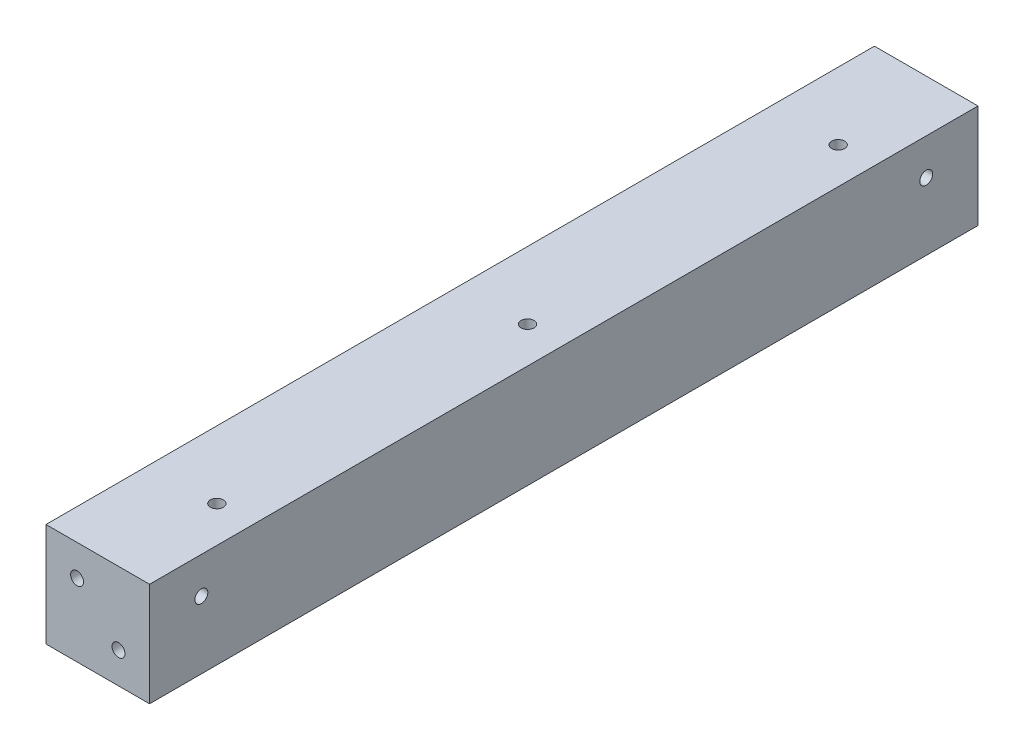
ISO-10303-21;
HEADER;
FILE_DESCRIPTION(('STEP AP214'),'2;1');
FILE_NAME('part.step','',(''),(''),'','','');
FILE_SCHEMA(('AUTOMOTIVE_DESIGN { 1 0 10303 214 1 1 1 1 }'));
ENDSEC;
DATA;
#1=APPLICATION_CONTEXT('core data for automotive mechanical design processes');
#2=APPLICATION_PROTOCOL_DEFINITION('international standard','automotive_design',2000,#1);
#3=PRODUCT_CONTEXT('',#1,'mechanical');
#4=PRODUCT('Part','Part','',(#3));
#5=PRODUCT_RELATED_PRODUCT_CATEGORY('part','',(#4));
#6=PRODUCT_DEFINITION_FORMATION('','',#4);
#7=PRODUCT_DEFINITION_CONTEXT('part definition',#1,'design');
#8=PRODUCT_DEFINITION('design','',#6,#7);
#9=PRODUCT_DEFINITION_SHAPE('','',#8);
#10=(LENGTH_UNIT() NAMED_UNIT(*) SI_UNIT(.MILLI.,.METRE.));
#11=(NAMED_UNIT(*) PLANE_ANGLE_UNIT() SI_UNIT($,.RADIAN.));
#12=(NAMED_UNIT(*) SI_UNIT($,.STERADIAN.) SOLID_ANGLE_UNIT());
#13=UNCERTAINTY_MEASURE_WITH_UNIT(LENGTH_MEASURE(1.E-05),#10,'distance_accuracy_value','');
#14=(GEOMETRIC_REPRESENTATION_CONTEXT(3) GLOBAL_UNCERTAINTY_ASSIGNED_CONTEXT((#13)) GLOBAL_UNIT_ASSIGNED_CONTEXT((#10,
#11,#12)) REPRESENTATION_CONTEXT('',''));
#15=CARTESIAN_POINT('',(0.,0.,0.));
#16=DIRECTION('',(0.,0.,1.));
#17=DIRECTION('',(1.,0.,0.));
#18=AXIS2_PLACEMENT_3D('',#15,#16,#17);
#19=CARTESIAN_POINT('',(0.,0.,160.));
#20=DIRECTION('',(1.,0.,0.));
#21=DIRECTION('',(0.,0.,-1.));
#22=AXIS2_PLACEMENT_3D('',#19,#20,#21);
#23=PLANE('',#22);
#24=CARTESIAN_POINT('',(0.,6.99999999999998,20.));
#25=DIRECTION('',(-1.,0.,0.));
#26=DIRECTION('',(0.,0.,1.));
#27=AXIS2_PLACEMENT_3D('',#24,#25,#26);
#28=CIRCLE('',#27,1.25);
#29=CARTESIAN_POINT('',(0.,6.99999999999998,21.25));
#30=VERTEX_POINT('',#29);
#31=EDGE_CURVE('E240',#30,#30,#28,.T.);
#32=ORIENTED_EDGE('',*,*,#31,.F.);
#33=EDGE_LOOP('',(#32));
#34=FACE_BOUND('',#33,.T.);
#35=CARTESIAN_POINT('',(0.,6.99999999999998,80.));
#36=DIRECTION('',(-1.,0.,0.));
#37=DIRECTION('',(0.,0.,1.));
#38=AXIS2_PLACEMENT_3D('',#35,#36,#37);
#39=CIRCLE('',#38,1.25);
#40=CARTESIAN_POINT('',(0.,6.99999999999998,81.25));
#41=VERTEX_POINT('',#40);
#42=EDGE_CURVE('E232',#41,#41,#39,.T.);
#43=ORIENTED_EDGE('',*,*,#42,.F.);
#44=EDGE_LOOP('',(#43));
#45=FACE_BOUND('',#44,.T.);
#46=CARTESIAN_POINT('',(0.,6.99999999999998,140.));
#47=DIRECTION('',(-1.,0.,0.));
#48=DIRECTION('',(0.,0.,1.));
#49=AXIS2_PLACEMENT_3D('',#46,#47,#48);
#50=CIRCLE('',#49,1.25000000000001);
#51=CARTESIAN_POINT('',(0.,6.99999999999998,141.25));
#52=VERTEX_POINT('',#51);
#53=EDGE_CURVE('E224',#52,#52,#50,.T.);
#54=ORIENTED_EDGE('',*,*,#53,.F.);
#55=EDGE_LOOP('',(#54));
#56=FACE_BOUND('',#55,.T.);
#57=DIRECTION('',(0.,-1.,0.));
#58=VECTOR('',#57,1.);
#59=CARTESIAN_POINT('',(0.,0.,0.));
#60=LINE('',#59,#58);
#61=CARTESIAN_POINT('',(0.,20.,0.));
#62=VERTEX_POINT('',#61);
#63=CARTESIAN_POINT('',(0.,0.,0.));
#64=VERTEX_POINT('',#63);
#65=EDGE_CURVE('E113',#62,#64,#60,.T.);
#66=ORIENTED_EDGE('',*,*,#65,.T.);
#67=DIRECTION('',(0.,0.,-1.));
#68=VECTOR('',#67,1.);
#69=CARTESIAN_POINT('',(0.,0.,160.));
#70=LINE('',#69,#68);
#71=CARTESIAN_POINT('',(0.,0.,160.));
#72=VERTEX_POINT('',#71);
#73=EDGE_CURVE('E11',#72,#64,#70,.T.);
#74=ORIENTED_EDGE('',*,*,#73,.F.);
#75=DIRECTION('',(0.,-1.,0.));
#76=VECTOR('',#75,1.);
#77=CARTESIAN_POINT('',(0.,0.,160.));
#78=LINE('',#77,#76);
#79=CARTESIAN_POINT('',(0.,20.,160.));
#80=VERTEX_POINT('',#79);
#81=EDGE_CURVE('E96',#80,#72,#78,.T.);
#82=ORIENTED_EDGE('',*,*,#81,.F.);
#83=DIRECTION('',(0.,0.,-1.));
#84=VECTOR('',#83,1.);
#85=CARTESIAN_POINT('',(0.,20.,160.));
#86=LINE('',#85,#84);
#87=EDGE_CURVE('E109',#80,#62,#86,.T.);
#88=ORIENTED_EDGE('',*,*,#87,.T.);
#89=EDGE_LOOP('',(#66,#74,#82,#88));
#90=FACE_BOUND('',#89,.T.);
#91=ADVANCED_FACE('F44',(#34,#45,#56,#90),#23,.F.);
#92=CARTESIAN_POINT('',(0.,0.,160.));
#93=DIRECTION('',(0.,1.,0.));
#94=DIRECTION('',(0.,0.,1.));
#95=AXIS2_PLACEMENT_3D('',#92,#93,#94);
#96=PLANE('',#95);
#97=CARTESIAN_POINT('',(7.,0.,10.));
#98=DIRECTION('',(0.,-1.,0.));
#99=DIRECTION('',(0.,0.,-1.));
#100=AXIS2_PLACEMENT_3D('',#97,#98,#99);
#101=CIRCLE('',#100,1.25);
#102=CARTESIAN_POINT('',(7.,0.,8.75));
#103=VERTEX_POINT('',#102);
#104=EDGE_CURVE('E193',#103,#103,#101,.T.);
#105=ORIENTED_EDGE('',*,*,#104,.F.);
#106=EDGE_LOOP('',(#105));
#107=FACE_BOUND('',#106,.T.);
#108=CARTESIAN_POINT('',(7.,0.,150.));
#109=DIRECTION('',(0.,-1.,0.));
#110=DIRECTION('',(0.,0.,-1.));
#111=AXIS2_PLACEMENT_3D('',#108,#109,#110);
#112=CIRCLE('',#111,1.25);
#113=CARTESIAN_POINT('',(7.,0.,148.75));
#114=VERTEX_POINT('',#113);
#115=EDGE_CURVE('E184',#114,#114,#112,.T.);
#116=ORIENTED_EDGE('',*,*,#115,.F.);
#117=EDGE_LOOP('',(#116));
#118=FACE_BOUND('',#117,.T.);
#119=DIRECTION('',(1.,0.,0.));
#120=VECTOR('',#119,1.);
#121=CARTESIAN_POINT('',(0.,0.,0.));
#122=LINE('',#121,#120);
#123=CARTESIAN_POINT('',(20.,0.,0.));
#124=VERTEX_POINT('',#123);
#125=EDGE_CURVE('E101',#64,#124,#122,.T.);
#126=ORIENTED_EDGE('',*,*,#125,.T.);
#127=DIRECTION('',(0.,0.,-1.));
#128=VECTOR('',#127,1.);
#129=CARTESIAN_POINT('',(20.,0.,160.));
#130=LINE('',#129,#128);
#131=CARTESIAN_POINT('',(20.,0.,160.));
#132=VERTEX_POINT('',#131);
#133=EDGE_CURVE('E53',#132,#124,#130,.T.);
#134=ORIENTED_EDGE('',*,*,#133,.F.);
#135=DIRECTION('',(1.,0.,0.));
#136=VECTOR('',#135,1.);
#137=CARTESIAN_POINT('',(0.,0.,160.));
#138=LINE('',#137,#136);
#139=EDGE_CURVE('E91',#72,#132,#138,.T.);
#140=ORIENTED_EDGE('',*,*,#139,.F.);
#141=ORIENTED_EDGE('',*,*,#73,.T.);
#142=EDGE_LOOP('',(#126,#134,#140,#141));
#143=FACE_BOUND('',#142,.T.);
#144=ADVANCED_FACE('F100',(#107,#118,#143),#96,.F.);
#145=CARTESIAN_POINT('',(20.,0.,160.));
#146=DIRECTION('',(-1.,0.,0.));
#147=DIRECTION('',(0.,0.,1.));
#148=AXIS2_PLACEMENT_3D('',#145,#146,#147);
#149=PLANE('',#148);
#150=CARTESIAN_POINT('',(20.,13.,10.));
#151=DIRECTION('',(1.,0.,0.));
#152=DIRECTION('',(0.,0.,-1.));
#153=AXIS2_PLACEMENT_3D('',#150,#151,#152);
#154=CIRCLE('',#153,1.25);
#155=CARTESIAN_POINT('',(20.,13.,8.75));
#156=VERTEX_POINT('',#155);
#157=EDGE_CURVE('E177',#156,#156,#154,.T.);
#158=ORIENTED_EDGE('',*,*,#157,.F.);
#159=EDGE_LOOP('',(#158));
#160=FACE_BOUND('',#159,.T.);
#161=CARTESIAN_POINT('',(20.,13.,150.));
#162=DIRECTION('',(1.,0.,0.));
#163=DIRECTION('',(0.,0.,-1.));
#164=AXIS2_PLACEMENT_3D('',#161,#162,#163);
#165=CIRCLE('',#164,1.25000000000001);
#166=CARTESIAN_POINT('',(20.,13.,148.75));
#167=VERTEX_POINT('',#166);
#168=EDGE_CURVE('E168',#167,#167,#165,.T.);
#169=ORIENTED_EDGE('',*,*,#168,.F.);
#170=EDGE_LOOP('',(#169));
#171=FACE_BOUND('',#170,.T.);
#172=DIRECTION('',(0.,1.,0.));
#173=VECTOR('',#172,1.);
#174=CARTESIAN_POINT('',(20.,0.,0.));
#175=LINE('',#174,#173);
#176=CARTESIAN_POINT('',(20.,20.,0.));
#177=VERTEX_POINT('',#176);
#178=EDGE_CURVE('E78',#124,#177,#175,.T.);
#179=ORIENTED_EDGE('',*,*,#178,.T.);
#180=DIRECTION('',(0.,0.,-1.));
#181=VECTOR('',#180,1.);
#182=CARTESIAN_POINT('',(20.,20.,160.));
#183=LINE('',#182,#181);
#184=CARTESIAN_POINT('',(20.,20.,160.));
#185=VERTEX_POINT('',#184);
#186=EDGE_CURVE('E103',#185,#177,#183,.T.);
#187=ORIENTED_EDGE('',*,*,#186,.F.);
#188=DIRECTION('',(0.,1.,0.));
#189=VECTOR('',#188,1.);
#190=CARTESIAN_POINT('',(20.,0.,160.));
#191=LINE('',#190,#189);
#192=EDGE_CURVE('E94',#132,#185,#191,.T.);
#193=ORIENTED_EDGE('',*,*,#192,.F.);
#194=ORIENTED_EDGE('',*,*,#133,.T.);
#195=EDGE_LOOP('',(#179,#187,#193,#194));
#196=FACE_BOUND('',#195,.T.);
#197=ADVANCED_FACE('F104',(#160,#171,#196),#149,.F.);
#198=CARTESIAN_POINT('',(0.,20.,160.));
#199=DIRECTION('',(0.,-1.,0.));
#200=DIRECTION('',(0.,0.,-1.));
#201=AXIS2_PLACEMENT_3D('',#198,#199,#200);
#202=PLANE('',#201);
#203=CARTESIAN_POINT('',(13.,20.,20.));
#204=DIRECTION('',(0.,1.,0.));
#205=DIRECTION('',(0.,0.,1.));
#206=AXIS2_PLACEMENT_3D('',#203,#204,#205);
#207=CIRCLE('',#206,1.25);
#208=CARTESIAN_POINT('',(13.,20.,21.25));
#209=VERTEX_POINT('',#208);
#210=EDGE_CURVE('E217',#209,#209,#207,.T.);
#211=ORIENTED_EDGE('',*,*,#210,.F.);
#212=EDGE_LOOP('',(#211));
#213=FACE_BOUND('',#212,.T.);
#214=CARTESIAN_POINT('',(13.,20.,80.));
#215=DIRECTION('',(0.,1.,0.));
#216=DIRECTION('',(0.,0.,1.));
#217=AXIS2_PLACEMENT_3D('',#214,#215,#216);
#218=CIRCLE('',#217,1.25);
#219=CARTESIAN_POINT('',(13.,20.,81.25));
#220=VERTEX_POINT('',#219);
#221=EDGE_CURVE('E209',#220,#220,#218,.T.);
#222=ORIENTED_EDGE('',*,*,#221,.F.);
#223=EDGE_LOOP('',(#222));
#224=FACE_BOUND('',#223,.T.);
#225=CARTESIAN_POINT('',(13.,20.,140.));
#226=DIRECTION('',(0.,1.,0.));
#227=DIRECTION('',(0.,0.,1.));
#228=AXIS2_PLACEMENT_3D('',#225,#226,#227);
#229=CIRCLE('',#228,1.25);
#230=CARTESIAN_POINT('',(13.,20.,141.25));
#231=VERTEX_POINT('',#230);
#232=EDGE_CURVE('E200',#231,#231,#229,.T.);
#233=ORIENTED_EDGE('',*,*,#232,.F.);
#234=EDGE_LOOP('',(#233));
#235=FACE_BOUND('',#234,.T.);
#236=DIRECTION('',(-1.,0.,0.));
#237=VECTOR('',#236,1.);
#238=CARTESIAN_POINT('',(0.,20.,0.));
#239=LINE('',#238,#237);
#240=EDGE_CURVE('E84',#177,#62,#239,.T.);
#241=ORIENTED_EDGE('',*,*,#240,.T.);
#242=ORIENTED_EDGE('',*,*,#87,.F.);
#243=DIRECTION('',(-1.,0.,0.));
#244=VECTOR('',#243,1.);
#245=CARTESIAN_POINT('',(0.,20.,160.));
#246=LINE('',#245,#244);
#247=EDGE_CURVE('E61',#185,#80,#246,.T.);
#248=ORIENTED_EDGE('',*,*,#247,.F.);
#249=ORIENTED_EDGE('',*,*,#186,.T.);
#250=EDGE_LOOP('',(#241,#242,#248,#249));
#251=FACE_BOUND('',#250,.T.);
#252=ADVANCED_FACE('F128',(#213,#224,#235,#251),#202,.F.);
#253=CARTESIAN_POINT('',(0.,0.,160.));
#254=DIRECTION('',(0.,0.,-1.));
#255=DIRECTION('',(-1.,0.,0.));
#256=AXIS2_PLACEMENT_3D('',#253,#254,#255);
#257=PLANE('',#256);
#258=CARTESIAN_POINT('',(6.,14.,160.));
#259=DIRECTION('',(0.,0.,1.));
#260=DIRECTION('',(1.,0.,0.));
#261=AXIS2_PLACEMENT_3D('',#258,#259,#260);
#262=CIRCLE('',#261,1.25);
#263=CARTESIAN_POINT('',(7.25,14.,160.));
#264=VERTEX_POINT('',#263);
#265=EDGE_CURVE('E145',#264,#264,#262,.T.);
#266=ORIENTED_EDGE('',*,*,#265,.F.);
#267=EDGE_LOOP('',(#266));
#268=FACE_BOUND('',#267,.T.);
#269=CARTESIAN_POINT('',(14.,6.,160.));
#270=DIRECTION('',(0.,0.,1.));
#271=DIRECTION('',(1.,0.,0.));
#272=AXIS2_PLACEMENT_3D('',#269,#270,#271);
#273=CIRCLE('',#272,1.25);
#274=CARTESIAN_POINT('',(15.25,6.,160.));
#275=VERTEX_POINT('',#274);
#276=EDGE_CURVE('E136',#275,#275,#273,.T.);
#277=ORIENTED_EDGE('',*,*,#276,.F.);
#278=EDGE_LOOP('',(#277));
#279=FACE_BOUND('',#278,.T.);
#280=ORIENTED_EDGE('',*,*,#81,.T.);
#281=ORIENTED_EDGE('',*,*,#139,.T.);
#282=ORIENTED_EDGE('',*,*,#192,.T.);
#283=ORIENTED_EDGE('',*,*,#247,.T.);
#284=EDGE_LOOP('',(#280,#281,#282,#283));
#285=FACE_BOUND('',#284,.T.);
#286=ADVANCED_FACE('F92',(#268,#279,#285),#257,.F.);
#287=CARTESIAN_POINT('',(0.,0.,0.));
#288=DIRECTION('',(0.,0.,-1.));
#289=DIRECTION('',(-1.,0.,0.));
#290=AXIS2_PLACEMENT_3D('',#287,#288,#289);
#291=PLANE('',#290);
#292=CARTESIAN_POINT('',(14.,6.,0.));
#293=DIRECTION('',(0.,0.,-1.));
#294=DIRECTION('',(-1.,0.,0.));
#295=AXIS2_PLACEMENT_3D('',#292,#293,#294);
#296=CIRCLE('',#295,1.25);
#297=CARTESIAN_POINT('',(12.75,6.,0.));
#298=VERTEX_POINT('',#297);
#299=EDGE_CURVE('E161',#298,#298,#296,.T.);
#300=ORIENTED_EDGE('',*,*,#299,.F.);
#301=EDGE_LOOP('',(#300));
#302=FACE_BOUND('',#301,.T.);
#303=CARTESIAN_POINT('',(6.,14.,0.));
#304=DIRECTION('',(0.,0.,-1.));
#305=DIRECTION('',(-1.,0.,0.));
#306=AXIS2_PLACEMENT_3D('',#303,#304,#305);
#307=CIRCLE('',#306,1.25);
#308=CARTESIAN_POINT('',(4.75,14.,0.));
#309=VERTEX_POINT('',#308);
#310=EDGE_CURVE('E152',#309,#309,#307,.T.);
#311=ORIENTED_EDGE('',*,*,#310,.F.);
#312=EDGE_LOOP('',(#311));
#313=FACE_BOUND('',#312,.T.);
#314=ORIENTED_EDGE('',*,*,#65,.F.);
#315=ORIENTED_EDGE('',*,*,#240,.F.);
#316=ORIENTED_EDGE('',*,*,#178,.F.);
#317=ORIENTED_EDGE('',*,*,#125,.F.);
#318=EDGE_LOOP('',(#314,#315,#316,#317));
#319=FACE_BOUND('',#318,.T.);
#320=ADVANCED_FACE('F131',(#302,#313,#319),#291,.T.);
#321=CARTESIAN_POINT('',(14.,6.,150.));
#322=DIRECTION('',(0.,0.,1.));
#323=DIRECTION('',(1.,0.,0.));
#324=AXIS2_PLACEMENT_3D('',#321,#322,#323);
#325=CYLINDRICAL_SURFACE('',#324,1.25);
#326=CARTESIAN_POINT('',(14.,6.,150.));
#327=DIRECTION('',(0.,0.,1.));
#328=DIRECTION('',(1.,0.,0.));
#329=AXIS2_PLACEMENT_3D('',#326,#327,#328);
#330=CIRCLE('',#329,1.25);
#331=CARTESIAN_POINT('',(15.25,6.,150.));
#332=VERTEX_POINT('',#331);
#333=EDGE_CURVE('E140',#332,#332,#330,.T.);
#334=ORIENTED_EDGE('',*,*,#333,.F.);
#335=EDGE_LOOP('',(#334));
#336=FACE_BOUND('',#335,.T.);
#337=ORIENTED_EDGE('',*,*,#276,.T.);
#338=EDGE_LOOP('',(#337));
#339=FACE_BOUND('',#338,.T.);
#340=ADVANCED_FACE('F361',(#336,#339),#325,.F.);
#341=CARTESIAN_POINT('',(14.,6.,150.));
#342=DIRECTION('',(0.,0.,1.));
#343=DIRECTION('',(1.,0.,0.));
#344=AXIS2_PLACEMENT_3D('',#341,#342,#343);
#345=PLANE('',#344);
#346=ORIENTED_EDGE('',*,*,#333,.T.);
#347=EDGE_LOOP('',(#346));
#348=FACE_BOUND('',#347,.T.);
#349=ADVANCED_FACE('F357',(#348),#345,.T.);
#350=CARTESIAN_POINT('',(6.,14.,150.));
#351=DIRECTION('',(0.,0.,1.));
#352=DIRECTION('',(1.,0.,0.));
#353=AXIS2_PLACEMENT_3D('',#350,#351,#352);
#354=CYLINDRICAL_SURFACE('',#353,1.25);
#355=CARTESIAN_POINT('',(6.,14.,150.));
#356=DIRECTION('',(0.,0.,1.));
#357=DIRECTION('',(1.,0.,0.));
#358=AXIS2_PLACEMENT_3D('',#355,#356,#357);
#359=CIRCLE('',#358,1.25);
#360=CARTESIAN_POINT('',(7.25,14.,150.));
#361=VERTEX_POINT('',#360);
#362=EDGE_CURVE('E117',#361,#361,#359,.T.);
#363=ORIENTED_EDGE('',*,*,#362,.F.);
#364=EDGE_LOOP('',(#363));
#365=FACE_BOUND('',#364,.T.);
#366=ORIENTED_EDGE('',*,*,#265,.T.);
#367=EDGE_LOOP('',(#366));
#368=FACE_BOUND('',#367,.T.);
#369=ADVANCED_FACE('F353',(#365,#368),#354,.F.);
#370=CARTESIAN_POINT('',(6.,14.,150.));
#371=DIRECTION('',(0.,0.,1.));
#372=DIRECTION('',(1.,0.,0.));
#373=AXIS2_PLACEMENT_3D('',#370,#371,#372);
#374=PLANE('',#373);
#375=ORIENTED_EDGE('',*,*,#362,.T.);
#376=EDGE_LOOP('',(#375));
#377=FACE_BOUND('',#376,.T.);
#378=ADVANCED_FACE('F349',(#377),#374,.T.);
#379=CARTESIAN_POINT('',(6.,14.,10.));
#380=DIRECTION('',(0.,0.,-1.));
#381=DIRECTION('',(-1.,0.,0.));
#382=AXIS2_PLACEMENT_3D('',#379,#380,#381);
#383=CYLINDRICAL_SURFACE('',#382,1.25);
#384=CARTESIAN_POINT('',(6.,14.,10.));
#385=DIRECTION('',(0.,0.,-1.));
#386=DIRECTION('',(-1.,0.,0.));
#387=AXIS2_PLACEMENT_3D('',#384,#385,#386);
#388=CIRCLE('',#387,1.25);
#389=CARTESIAN_POINT('',(4.75,14.,10.));
#390=VERTEX_POINT('',#389);
#391=EDGE_CURVE('E156',#390,#390,#388,.T.);
#392=ORIENTED_EDGE('',*,*,#391,.F.);
#393=EDGE_LOOP('',(#392));
#394=FACE_BOUND('',#393,.T.);
#395=ORIENTED_EDGE('',*,*,#310,.T.);
#396=EDGE_LOOP('',(#395));
#397=FACE_BOUND('',#396,.T.);
#398=ADVANCED_FACE('F345',(#394,#397),#383,.F.);
#399=CARTESIAN_POINT('',(6.,14.,10.));
#400=DIRECTION('',(0.,0.,-1.));
#401=DIRECTION('',(-1.,0.,0.));
#402=AXIS2_PLACEMENT_3D('',#399,#400,#401);
#403=PLANE('',#402);
#404=ORIENTED_EDGE('',*,*,#391,.T.);
#405=EDGE_LOOP('',(#404));
#406=FACE_BOUND('',#405,.T.);
#407=ADVANCED_FACE('F341',(#406),#403,.T.);
#408=CARTESIAN_POINT('',(14.,6.,10.));
#409=DIRECTION('',(0.,0.,-1.));
#410=DIRECTION('',(-1.,0.,0.));
#411=AXIS2_PLACEMENT_3D('',#408,#409,#410);
#412=CYLINDRICAL_SURFACE('',#411,1.25);
#413=CARTESIAN_POINT('',(14.,6.,10.));
#414=DIRECTION('',(0.,0.,-1.));
#415=DIRECTION('',(-1.,0.,0.));
#416=AXIS2_PLACEMENT_3D('',#413,#414,#415);
#417=CIRCLE('',#416,1.25);
#418=CARTESIAN_POINT('',(12.75,6.,10.));
#419=VERTEX_POINT('',#418);
#420=EDGE_CURVE('E141',#419,#419,#417,.T.);
#421=ORIENTED_EDGE('',*,*,#420,.F.);
#422=EDGE_LOOP('',(#421));
#423=FACE_BOUND('',#422,.T.);
#424=ORIENTED_EDGE('',*,*,#299,.T.);
#425=EDGE_LOOP('',(#424));
#426=FACE_BOUND('',#425,.T.);
#427=ADVANCED_FACE('F337',(#423,#426),#412,.F.);
#428=CARTESIAN_POINT('',(14.,6.,10.));
#429=DIRECTION('',(0.,0.,-1.));
#430=DIRECTION('',(-1.,0.,0.));
#431=AXIS2_PLACEMENT_3D('',#428,#429,#430);
#432=PLANE('',#431);
#433=ORIENTED_EDGE('',*,*,#420,.T.);
#434=EDGE_LOOP('',(#433));
#435=FACE_BOUND('',#434,.T.);
#436=ADVANCED_FACE('F333',(#435),#432,.T.);
#437=CARTESIAN_POINT('',(10.,13.,150.));
#438=DIRECTION('',(1.,0.,0.));
#439=DIRECTION('',(0.,0.,-1.));
#440=AXIS2_PLACEMENT_3D('',#437,#438,#439);
#441=CYLINDRICAL_SURFACE('',#440,1.25000000000001);
#442=CARTESIAN_POINT('',(10.,13.,150.));
#443=DIRECTION('',(1.,0.,0.));
#444=DIRECTION('',(0.,0.,-1.));
#445=AXIS2_PLACEMENT_3D('',#442,#443,#444);
#446=CIRCLE('',#445,1.25000000000001);
#447=CARTESIAN_POINT('',(10.,13.,148.75));
#448=VERTEX_POINT('',#447);
#449=EDGE_CURVE('E172',#448,#448,#446,.T.);
#450=ORIENTED_EDGE('',*,*,#449,.F.);
#451=EDGE_LOOP('',(#450));
#452=FACE_BOUND('',#451,.T.);
#453=ORIENTED_EDGE('',*,*,#168,.T.);
#454=EDGE_LOOP('',(#453));
#455=FACE_BOUND('',#454,.T.);
#456=ADVANCED_FACE('F329',(#452,#455),#441,.F.);
#457=CARTESIAN_POINT('',(10.,13.,150.));
#458=DIRECTION('',(1.,0.,0.));
#459=DIRECTION('',(0.,0.,-1.));
#460=AXIS2_PLACEMENT_3D('',#457,#458,#459);
#461=PLANE('',#460);
#462=ORIENTED_EDGE('',*,*,#449,.T.);
#463=EDGE_LOOP('',(#462));
#464=FACE_BOUND('',#463,.T.);
#465=ADVANCED_FACE('F325',(#464),#461,.T.);
#466=CARTESIAN_POINT('',(10.,13.,10.));
#467=DIRECTION('',(1.,0.,0.));
#468=DIRECTION('',(0.,0.,-1.));
#469=AXIS2_PLACEMENT_3D('',#466,#467,#468);
#470=CYLINDRICAL_SURFACE('',#469,1.25);
#471=CARTESIAN_POINT('',(10.,13.,10.));
#472=DIRECTION('',(1.,0.,0.));
#473=DIRECTION('',(0.,0.,-1.));
#474=AXIS2_PLACEMENT_3D('',#471,#472,#473);
#475=CIRCLE('',#474,1.25);
#476=CARTESIAN_POINT('',(10.,13.,8.75));
#477=VERTEX_POINT('',#476);
#478=EDGE_CURVE('E157',#477,#477,#475,.T.);
#479=ORIENTED_EDGE('',*,*,#478,.F.);
#480=EDGE_LOOP('',(#479));
#481=FACE_BOUND('',#480,.T.);
#482=ORIENTED_EDGE('',*,*,#157,.T.);
#483=EDGE_LOOP('',(#482));
#484=FACE_BOUND('',#483,.T.);
#485=ADVANCED_FACE('F321',(#481,#484),#470,.F.);
#486=CARTESIAN_POINT('',(10.,13.,10.));
#487=DIRECTION('',(1.,0.,0.));
#488=DIRECTION('',(0.,0.,-1.));
#489=AXIS2_PLACEMENT_3D('',#486,#487,#488);
#490=PLANE('',#489);
#491=ORIENTED_EDGE('',*,*,#478,.T.);
#492=EDGE_LOOP('',(#491));
#493=FACE_BOUND('',#492,.T.);
#494=ADVANCED_FACE('F317',(#493),#490,.T.);
#495=CARTESIAN_POINT('',(7.,10.,150.));
#496=DIRECTION('',(0.,-1.,0.));
#497=DIRECTION('',(0.,0.,-1.));
#498=AXIS2_PLACEMENT_3D('',#495,#496,#497);
#499=CYLINDRICAL_SURFACE('',#498,1.25);
#500=CARTESIAN_POINT('',(7.,10.,150.));
#501=DIRECTION('',(0.,-1.,0.));
#502=DIRECTION('',(0.,0.,-1.));
#503=AXIS2_PLACEMENT_3D('',#500,#501,#502);
#504=CIRCLE('',#503,1.25);
#505=CARTESIAN_POINT('',(7.,10.,148.75));
#506=VERTEX_POINT('',#505);
#507=EDGE_CURVE('E188',#506,#506,#504,.T.);
#508=ORIENTED_EDGE('',*,*,#507,.F.);
#509=EDGE_LOOP('',(#508));
#510=FACE_BOUND('',#509,.T.);
#511=ORIENTED_EDGE('',*,*,#115,.T.);
#512=EDGE_LOOP('',(#511));
#513=FACE_BOUND('',#512,.T.);
#514=ADVANCED_FACE('F313',(#510,#513),#499,.F.);
#515=CARTESIAN_POINT('',(7.,10.,150.));
#516=DIRECTION('',(0.,-1.,0.));
#517=DIRECTION('',(0.,0.,-1.));
#518=AXIS2_PLACEMENT_3D('',#515,#516,#517);
#519=PLANE('',#518);
#520=ORIENTED_EDGE('',*,*,#507,.T.);
#521=EDGE_LOOP('',(#520));
#522=FACE_BOUND('',#521,.T.);
#523=ADVANCED_FACE('F309',(#522),#519,.T.);
#524=CARTESIAN_POINT('',(7.,10.,10.));
#525=DIRECTION('',(0.,-1.,0.));
#526=DIRECTION('',(0.,0.,-1.));
#527=AXIS2_PLACEMENT_3D('',#524,#525,#526);
#528=CYLINDRICAL_SURFACE('',#527,1.25);
#529=CARTESIAN_POINT('',(7.,10.,10.));
#530=DIRECTION('',(0.,-1.,0.));
#531=DIRECTION('',(0.,0.,-1.));
#532=AXIS2_PLACEMENT_3D('',#529,#530,#531);
#533=CIRCLE('',#532,1.25);
#534=CARTESIAN_POINT('',(7.,10.,8.75));
#535=VERTEX_POINT('',#534);
#536=EDGE_CURVE('E173',#535,#535,#533,.T.);
#537=ORIENTED_EDGE('',*,*,#536,.F.);
#538=EDGE_LOOP('',(#537));
#539=FACE_BOUND('',#538,.T.);
#540=ORIENTED_EDGE('',*,*,#104,.T.);
#541=EDGE_LOOP('',(#540));
#542=FACE_BOUND('',#541,.T.);
#543=ADVANCED_FACE('F305',(#539,#542),#528,.F.);
#544=CARTESIAN_POINT('',(7.,10.,10.));
#545=DIRECTION('',(0.,-1.,0.));
#546=DIRECTION('',(0.,0.,-1.));
#547=AXIS2_PLACEMENT_3D('',#544,#545,#546);
#548=PLANE('',#547);
#549=ORIENTED_EDGE('',*,*,#536,.T.);
#550=EDGE_LOOP('',(#549));
#551=FACE_BOUND('',#550,.T.);
#552=ADVANCED_FACE('F301',(#551),#548,.T.);
#553=CARTESIAN_POINT('',(13.,10.,140.));
#554=DIRECTION('',(0.,1.,0.));
#555=DIRECTION('',(0.,0.,1.));
#556=AXIS2_PLACEMENT_3D('',#553,#554,#555);
#557=CYLINDRICAL_SURFACE('',#556,1.25);
#558=CARTESIAN_POINT('',(13.,10.,140.));
#559=DIRECTION('',(0.,1.,0.));
#560=DIRECTION('',(0.,0.,1.));
#561=AXIS2_PLACEMENT_3D('',#558,#559,#560);
#562=CIRCLE('',#561,1.25);
#563=CARTESIAN_POINT('',(13.,10.,141.25));
#564=VERTEX_POINT('',#563);
#565=EDGE_CURVE('E204',#564,#564,#562,.T.);
#566=ORIENTED_EDGE('',*,*,#565,.F.);
#567=EDGE_LOOP('',(#566));
#568=FACE_BOUND('',#567,.T.);
#569=ORIENTED_EDGE('',*,*,#232,.T.);
#570=EDGE_LOOP('',(#569));
#571=FACE_BOUND('',#570,.T.);
#572=ADVANCED_FACE('F297',(#568,#571),#557,.F.);
#573=CARTESIAN_POINT('',(13.,10.,140.));
#574=DIRECTION('',(0.,1.,0.));
#575=DIRECTION('',(0.,0.,1.));
#576=AXIS2_PLACEMENT_3D('',#573,#574,#575);
#577=PLANE('',#576);
#578=ORIENTED_EDGE('',*,*,#565,.T.);
#579=EDGE_LOOP('',(#578));
#580=FACE_BOUND('',#579,.T.);
#581=ADVANCED_FACE('F293',(#580),#577,.T.);
#582=CARTESIAN_POINT('',(13.,10.,80.));
#583=DIRECTION('',(0.,1.,0.));
#584=DIRECTION('',(0.,0.,1.));
#585=AXIS2_PLACEMENT_3D('',#582,#583,#584);
#586=CYLINDRICAL_SURFACE('',#585,1.25);
#587=CARTESIAN_POINT('',(13.,10.,80.));
#588=DIRECTION('',(0.,1.,0.));
#589=DIRECTION('',(0.,0.,1.));
#590=AXIS2_PLACEMENT_3D('',#587,#588,#589);
#591=CIRCLE('',#590,1.25);
#592=CARTESIAN_POINT('',(13.,10.,81.25));
#593=VERTEX_POINT('',#592);
#594=EDGE_CURVE('E213',#593,#593,#591,.T.);
#595=ORIENTED_EDGE('',*,*,#594,.F.);
#596=EDGE_LOOP('',(#595));
#597=FACE_BOUND('',#596,.T.);
#598=ORIENTED_EDGE('',*,*,#221,.T.);
#599=EDGE_LOOP('',(#598));
#600=FACE_BOUND('',#599,.T.);
#601=ADVANCED_FACE('F289',(#597,#600),#586,.F.);
#602=CARTESIAN_POINT('',(13.,10.,80.));
#603=DIRECTION('',(0.,1.,0.));
#604=DIRECTION('',(0.,0.,1.));
#605=AXIS2_PLACEMENT_3D('',#602,#603,#604);
#606=PLANE('',#605);
#607=ORIENTED_EDGE('',*,*,#594,.T.);
#608=EDGE_LOOP('',(#607));
#609=FACE_BOUND('',#608,.T.);
#610=ADVANCED_FACE('F285',(#609),#606,.T.);
#611=CARTESIAN_POINT('',(13.,10.,20.));
#612=DIRECTION('',(0.,1.,0.));
#613=DIRECTION('',(0.,0.,1.));
#614=AXIS2_PLACEMENT_3D('',#611,#612,#613);
#615=CYLINDRICAL_SURFACE('',#614,1.25);
#616=CARTESIAN_POINT('',(13.,10.,20.));
#617=DIRECTION('',(0.,1.,0.));
#618=DIRECTION('',(0.,0.,1.));
#619=AXIS2_PLACEMENT_3D('',#616,#617,#618);
#620=CIRCLE('',#619,1.25);
#621=CARTESIAN_POINT('',(13.,10.,21.25));
#622=VERTEX_POINT('',#621);
#623=EDGE_CURVE('E189',#622,#622,#620,.T.);
#624=ORIENTED_EDGE('',*,*,#623,.F.);
#625=EDGE_LOOP('',(#624));
#626=FACE_BOUND('',#625,.T.);
#627=ORIENTED_EDGE('',*,*,#210,.T.);
#628=EDGE_LOOP('',(#627));
#629=FACE_BOUND('',#628,.T.);
#630=ADVANCED_FACE('F277',(#626,#629),#615,.F.);
#631=CARTESIAN_POINT('',(13.,10.,20.));
#632=DIRECTION('',(0.,1.,0.));
#633=DIRECTION('',(0.,0.,1.));
#634=AXIS2_PLACEMENT_3D('',#631,#632,#633);
#635=PLANE('',#634);
#636=ORIENTED_EDGE('',*,*,#623,.T.);
#637=EDGE_LOOP('',(#636));
#638=FACE_BOUND('',#637,.T.);
#639=ADVANCED_FACE('F267',(#638),#635,.T.);
#640=CARTESIAN_POINT('',(10.,6.99999999999998,140.));
#641=DIRECTION('',(-1.,0.,0.));
#642=DIRECTION('',(0.,0.,1.));
#643=AXIS2_PLACEMENT_3D('',#640,#641,#642);
#644=CYLINDRICAL_SURFACE('',#643,1.25000000000001);
#645=CARTESIAN_POINT('',(10.,6.99999999999998,140.));
#646=DIRECTION('',(-1.,0.,0.));
#647=DIRECTION('',(0.,0.,1.));
#648=AXIS2_PLACEMENT_3D('',#645,#646,#647);
#649=CIRCLE('',#648,1.25000000000001);
#650=CARTESIAN_POINT('',(10.,6.99999999999998,141.25));
#651=VERTEX_POINT('',#650);
#652=EDGE_CURVE('E228',#651,#651,#649,.T.);
#653=ORIENTED_EDGE('',*,*,#652,.F.);
#654=EDGE_LOOP('',(#653));
#655=FACE_BOUND('',#654,.T.);
#656=ORIENTED_EDGE('',*,*,#53,.T.);
#657=EDGE_LOOP('',(#656));
#658=FACE_BOUND('',#657,.T.);
#659=ADVANCED_FACE('F264',(#655,#658),#644,.F.);
#660=CARTESIAN_POINT('',(10.,6.99999999999998,140.));
#661=DIRECTION('',(-1.,0.,0.));
#662=DIRECTION('',(0.,0.,1.));
#663=AXIS2_PLACEMENT_3D('',#660,#661,#662);
#664=PLANE('',#663);
#665=ORIENTED_EDGE('',*,*,#652,.T.);
#666=EDGE_LOOP('',(#665));
#667=FACE_BOUND('',#666,.T.);
#668=ADVANCED_FACE('F266',(#667),#664,.T.);
#669=CARTESIAN_POINT('',(10.,6.99999999999998,80.));
#670=DIRECTION('',(-1.,0.,0.));
#671=DIRECTION('',(0.,0.,1.));
#672=AXIS2_PLACEMENT_3D('',#669,#670,#671);
#673=CYLINDRICAL_SURFACE('',#672,1.25);
#674=CARTESIAN_POINT('',(10.,6.99999999999998,80.));
#675=DIRECTION('',(-1.,0.,0.));
#676=DIRECTION('',(0.,0.,1.));
#677=AXIS2_PLACEMENT_3D('',#674,#675,#676);
#678=CIRCLE('',#677,1.25);
#679=CARTESIAN_POINT('',(10.,6.99999999999998,81.25));
#680=VERTEX_POINT('',#679);
#681=EDGE_CURVE('E236',#680,#680,#678,.T.);
#682=ORIENTED_EDGE('',*,*,#681,.F.);
#683=EDGE_LOOP('',(#682));
#684=FACE_BOUND('',#683,.T.);
#685=ORIENTED_EDGE('',*,*,#42,.T.);
#686=EDGE_LOOP('',(#685));
#687=FACE_BOUND('',#686,.T.);
#688=ADVANCED_FACE('F274',(#684,#687),#673,.F.);
#689=CARTESIAN_POINT('',(10.,6.99999999999998,80.));
#690=DIRECTION('',(-1.,0.,0.));
#691=DIRECTION('',(0.,0.,1.));
#692=AXIS2_PLACEMENT_3D('',#689,#690,#691);
#693=PLANE('',#692);
#694=ORIENTED_EDGE('',*,*,#681,.T.);
#695=EDGE_LOOP('',(#694));
#696=FACE_BOUND('',#695,.T.);
#697=ADVANCED_FACE('F254',(#696),#693,.T.);
#698=CARTESIAN_POINT('',(10.,6.99999999999998,20.));
#699=DIRECTION('',(-1.,0.,0.));
#700=DIRECTION('',(0.,0.,1.));
#701=AXIS2_PLACEMENT_3D('',#698,#699,#700);
#702=CYLINDRICAL_SURFACE('',#701,1.25);
#703=CARTESIAN_POINT('',(10.,6.99999999999998,20.));
#704=DIRECTION('',(-1.,0.,0.));
#705=DIRECTION('',(0.,0.,1.));
#706=AXIS2_PLACEMENT_3D('',#703,#704,#705);
#707=CIRCLE('',#706,1.25);
#708=CARTESIAN_POINT('',(10.,6.99999999999998,21.25));
#709=VERTEX_POINT('',#708);
#710=EDGE_CURVE('E205',#709,#709,#707,.T.);
#711=ORIENTED_EDGE('',*,*,#710,.F.);
#712=EDGE_LOOP('',(#711));
#713=FACE_BOUND('',#712,.T.);
#714=ORIENTED_EDGE('',*,*,#31,.T.);
#715=EDGE_LOOP('',(#714));
#716=FACE_BOUND('',#715,.T.);
#717=ADVANCED_FACE('F251',(#713,#716),#702,.F.);
#718=CARTESIAN_POINT('',(10.,6.99999999999998,20.));
#719=DIRECTION('',(-1.,0.,0.));
#720=DIRECTION('',(0.,0.,1.));
#721=AXIS2_PLACEMENT_3D('',#718,#719,#720);
#722=PLANE('',#721);
#723=ORIENTED_EDGE('',*,*,#710,.T.);
#724=EDGE_LOOP('',(#723));
#725=FACE_BOUND('',#724,.T.);
#726=ADVANCED_FACE('F249',(#725),#722,.T.);
#727=CLOSED_SHELL('',(#91,#144,#197,#252,#286,#320,#340,#349,#369,#378,#398,#407,#427,#436,#456,
#465,#485,#494,#514,#523,#543,#552,#572,#581,#601,#610,#630,#639,#659,#668,#688,#697,#717,#726));
#728=MANIFOLD_SOLID_BREP('B2',#727);
#729=ADVANCED_BREP_SHAPE_REPRESENTATION('',(#18,#728),#14);
#730=SHAPE_DEFINITION_REPRESENTATION(#9,#729);
ENDSEC;
END-ISO-10303-21;
